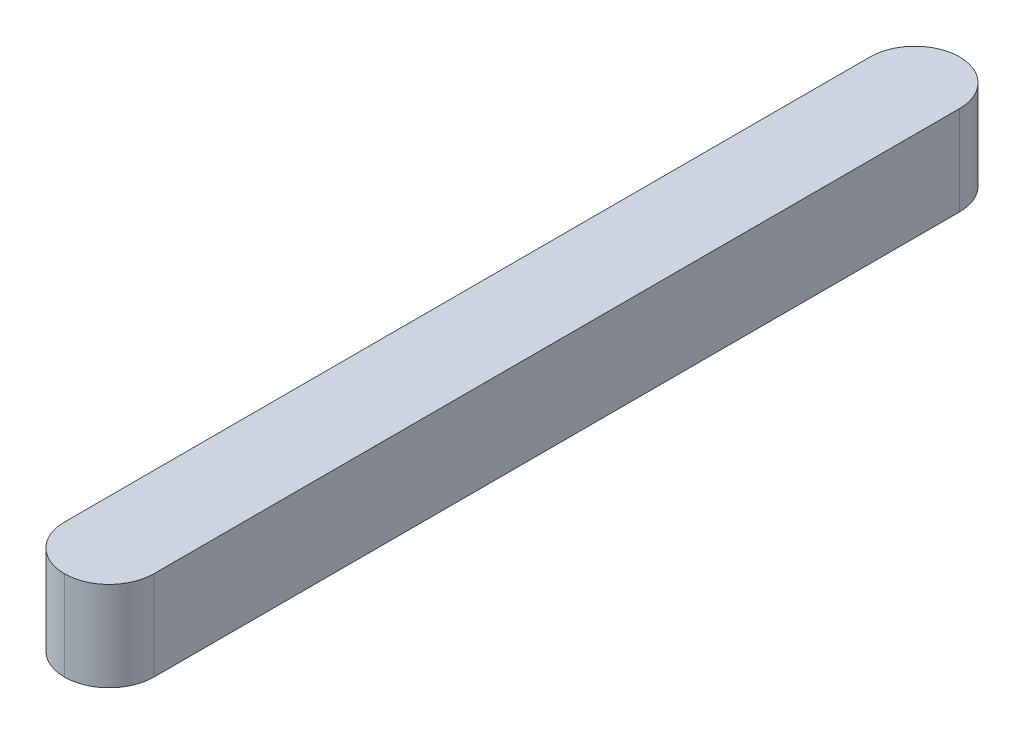
ISO-10303-21;
HEADER;
FILE_DESCRIPTION(('STEP AP214'),'2;1');
FILE_NAME('part.step','',(''),(''),'','','');
FILE_SCHEMA(('AUTOMOTIVE_DESIGN { 1 0 10303 214 1 1 1 1 }'));
ENDSEC;
DATA;
#1=APPLICATION_CONTEXT('core data for automotive mechanical design processes');
#2=APPLICATION_PROTOCOL_DEFINITION('international standard','automotive_design',2000,#1);
#3=PRODUCT_CONTEXT('',#1,'mechanical');
#4=PRODUCT('Part','Part','',(#3));
#5=PRODUCT_RELATED_PRODUCT_CATEGORY('part','',(#4));
#6=PRODUCT_DEFINITION_FORMATION('','',#4);
#7=PRODUCT_DEFINITION_CONTEXT('part definition',#1,'design');
#8=PRODUCT_DEFINITION('design','',#6,#7);
#9=PRODUCT_DEFINITION_SHAPE('','',#8);
#10=(LENGTH_UNIT() NAMED_UNIT(*) SI_UNIT(.MILLI.,.METRE.));
#11=(NAMED_UNIT(*) PLANE_ANGLE_UNIT() SI_UNIT($,.RADIAN.));
#12=(NAMED_UNIT(*) SI_UNIT($,.STERADIAN.) SOLID_ANGLE_UNIT());
#13=UNCERTAINTY_MEASURE_WITH_UNIT(LENGTH_MEASURE(1.E-05),#10,'distance_accuracy_value','');
#14=(GEOMETRIC_REPRESENTATION_CONTEXT(3) GLOBAL_UNCERTAINTY_ASSIGNED_CONTEXT((#13)) GLOBAL_UNIT_ASSIGNED_CONTEXT((#10,
#11,#12)) REPRESENTATION_CONTEXT('',''));
#15=CARTESIAN_POINT('',(0.,0.,0.));
#16=DIRECTION('',(0.,0.,1.));
#17=DIRECTION('',(1.,0.,0.));
#18=AXIS2_PLACEMENT_3D('',#15,#16,#17);
#19=CARTESIAN_POINT('',(0.,0.,60.));
#20=DIRECTION('',(1.,0.,0.));
#21=DIRECTION('',(0.,0.,-1.));
#22=AXIS2_PLACEMENT_3D('',#19,#20,#21);
#23=PLANE('',#22);
#24=DIRECTION('',(0.,0.,-1.));
#25=VECTOR('',#24,1.);
#26=CARTESIAN_POINT('',(0.,0.,60.));
#27=LINE('',#26,#25);
#28=CARTESIAN_POINT('',(0.,0.,57.));
#29=VERTEX_POINT('',#28);
#30=CARTESIAN_POINT('',(0.,0.,3.));
#31=VERTEX_POINT('',#30);
#32=EDGE_CURVE('E111',#29,#31,#27,.T.);
#33=ORIENTED_EDGE('',*,*,#32,.F.);
#34=DIRECTION('',(0.,-1.,0.));
#35=VECTOR('',#34,1.);
#36=CARTESIAN_POINT('',(0.,0.,57.));
#37=LINE('',#36,#35);
#38=CARTESIAN_POINT('',(0.,6.,57.));
#39=VERTEX_POINT('',#38);
#40=EDGE_CURVE('E11',#29,#39,#37,.F.);
#41=ORIENTED_EDGE('',*,*,#40,.T.);
#42=DIRECTION('',(0.,0.,-1.));
#43=VECTOR('',#42,1.);
#44=CARTESIAN_POINT('',(0.,6.,60.));
#45=LINE('',#44,#43);
#46=CARTESIAN_POINT('',(0.,6.,3.));
#47=VERTEX_POINT('',#46);
#48=EDGE_CURVE('E107',#39,#47,#45,.T.);
#49=ORIENTED_EDGE('',*,*,#48,.T.);
#50=DIRECTION('',(0.,-1.,0.));
#51=VECTOR('',#50,1.);
#52=CARTESIAN_POINT('',(0.,0.,3.));
#53=LINE('',#52,#51);
#54=EDGE_CURVE('E40',#47,#31,#53,.T.);
#55=ORIENTED_EDGE('',*,*,#54,.T.);
#56=EDGE_LOOP('',(#33,#41,#49,#55));
#57=FACE_BOUND('',#56,.T.);
#58=ADVANCED_FACE('F33',(#57),#23,.F.);
#59=CARTESIAN_POINT('',(0.,0.,60.));
#60=DIRECTION('',(0.,1.,0.));
#61=DIRECTION('',(0.,0.,1.));
#62=AXIS2_PLACEMENT_3D('',#59,#60,#61);
#63=PLANE('',#62);
#64=DIRECTION('',(0.,0.,-1.));
#65=VECTOR('',#64,1.);
#66=CARTESIAN_POINT('',(6.,0.,60.));
#67=LINE('',#66,#65);
#68=CARTESIAN_POINT('',(6.,0.,57.));
#69=VERTEX_POINT('',#68);
#70=CARTESIAN_POINT('',(6.,0.,3.));
#71=VERTEX_POINT('',#70);
#72=EDGE_CURVE('E106',#69,#71,#67,.T.);
#73=ORIENTED_EDGE('',*,*,#72,.F.);
#74=CARTESIAN_POINT('',(3.,0.,57.));
#75=DIRECTION('',(0.,1.,0.));
#76=DIRECTION('',(0.,0.,1.));
#77=AXIS2_PLACEMENT_3D('',#74,#75,#76);
#78=CIRCLE('',#77,3.);
#79=CARTESIAN_POINT('',(3.,0.,60.));
#80=VERTEX_POINT('',#79);
#81=EDGE_CURVE('E110',#69,#80,#78,.F.);
#82=ORIENTED_EDGE('',*,*,#81,.T.);
#83=CARTESIAN_POINT('',(3.,0.,57.));
#84=DIRECTION('',(0.,1.,0.));
#85=DIRECTION('',(0.,0.,1.));
#86=AXIS2_PLACEMENT_3D('',#83,#84,#85);
#87=CIRCLE('',#86,3.);
#88=EDGE_CURVE('E53',#80,#29,#87,.F.);
#89=ORIENTED_EDGE('',*,*,#88,.T.);
#90=ORIENTED_EDGE('',*,*,#32,.T.);
#91=CARTESIAN_POINT('',(3.,0.,3.));
#92=DIRECTION('',(0.,1.,0.));
#93=DIRECTION('',(0.,0.,1.));
#94=AXIS2_PLACEMENT_3D('',#91,#92,#93);
#95=CIRCLE('',#94,3.);
#96=CARTESIAN_POINT('',(3.,0.,0.));
#97=VERTEX_POINT('',#96);
#98=EDGE_CURVE('E95',#31,#97,#95,.F.);
#99=ORIENTED_EDGE('',*,*,#98,.T.);
#100=CARTESIAN_POINT('',(3.,0.,3.));
#101=DIRECTION('',(0.,1.,0.));
#102=DIRECTION('',(0.,0.,1.));
#103=AXIS2_PLACEMENT_3D('',#100,#101,#102);
#104=CIRCLE('',#103,3.);
#105=EDGE_CURVE('E123',#97,#71,#104,.F.);
#106=ORIENTED_EDGE('',*,*,#105,.T.);
#107=EDGE_LOOP('',(#73,#82,#89,#90,#99,#106));
#108=FACE_BOUND('',#107,.T.);
#109=ADVANCED_FACE('F126',(#108),#63,.F.);
#110=CARTESIAN_POINT('',(6.,0.,60.));
#111=DIRECTION('',(-1.,0.,0.));
#112=DIRECTION('',(0.,0.,1.));
#113=AXIS2_PLACEMENT_3D('',#110,#111,#112);
#114=PLANE('',#113);
#115=ORIENTED_EDGE('',*,*,#72,.T.);
#116=DIRECTION('',(0.,1.,0.));
#117=VECTOR('',#116,1.);
#118=CARTESIAN_POINT('',(6.,6.,3.));
#119=LINE('',#118,#117);
#120=CARTESIAN_POINT('',(6.,6.,3.));
#121=VERTEX_POINT('',#120);
#122=EDGE_CURVE('E105',#71,#121,#119,.T.);
#123=ORIENTED_EDGE('',*,*,#122,.T.);
#124=DIRECTION('',(0.,0.,-1.));
#125=VECTOR('',#124,1.);
#126=CARTESIAN_POINT('',(6.,6.,60.));
#127=LINE('',#126,#125);
#128=CARTESIAN_POINT('',(6.,6.,57.));
#129=VERTEX_POINT('',#128);
#130=EDGE_CURVE('E87',#129,#121,#127,.T.);
#131=ORIENTED_EDGE('',*,*,#130,.F.);
#132=DIRECTION('',(0.,1.,0.));
#133=VECTOR('',#132,1.);
#134=CARTESIAN_POINT('',(6.,0.,57.));
#135=LINE('',#134,#133);
#136=EDGE_CURVE('E102',#129,#69,#135,.F.);
#137=ORIENTED_EDGE('',*,*,#136,.T.);
#138=EDGE_LOOP('',(#115,#123,#131,#137));
#139=FACE_BOUND('',#138,.T.);
#140=ADVANCED_FACE('F101',(#139),#114,.F.);
#141=CARTESIAN_POINT('',(0.,6.,60.));
#142=DIRECTION('',(0.,-1.,0.));
#143=DIRECTION('',(0.,0.,-1.));
#144=AXIS2_PLACEMENT_3D('',#141,#142,#143);
#145=PLANE('',#144);
#146=CARTESIAN_POINT('',(3.,6.,57.));
#147=DIRECTION('',(0.,-1.,0.));
#148=DIRECTION('',(0.,0.,-1.));
#149=AXIS2_PLACEMENT_3D('',#146,#147,#148);
#150=CIRCLE('',#149,3.);
#151=CARTESIAN_POINT('',(3.,6.,60.));
#152=VERTEX_POINT('',#151);
#153=EDGE_CURVE('E90',#39,#152,#150,.F.);
#154=ORIENTED_EDGE('',*,*,#153,.T.);
#155=CARTESIAN_POINT('',(3.,6.,57.));
#156=DIRECTION('',(0.,-1.,0.));
#157=DIRECTION('',(0.,0.,-1.));
#158=AXIS2_PLACEMENT_3D('',#155,#156,#157);
#159=CIRCLE('',#158,3.);
#160=EDGE_CURVE('E84',#152,#129,#159,.F.);
#161=ORIENTED_EDGE('',*,*,#160,.T.);
#162=ORIENTED_EDGE('',*,*,#130,.T.);
#163=CARTESIAN_POINT('',(3.,6.,3.));
#164=DIRECTION('',(0.,-1.,0.));
#165=DIRECTION('',(0.,0.,-1.));
#166=AXIS2_PLACEMENT_3D('',#163,#164,#165);
#167=CIRCLE('',#166,3.);
#168=CARTESIAN_POINT('',(3.,6.,0.));
#169=VERTEX_POINT('',#168);
#170=EDGE_CURVE('E119',#121,#169,#167,.F.);
#171=ORIENTED_EDGE('',*,*,#170,.T.);
#172=CARTESIAN_POINT('',(3.,6.,3.));
#173=DIRECTION('',(0.,-1.,0.));
#174=DIRECTION('',(0.,0.,-1.));
#175=AXIS2_PLACEMENT_3D('',#172,#173,#174);
#176=CIRCLE('',#175,3.);
#177=EDGE_CURVE('E113',#169,#47,#176,.F.);
#178=ORIENTED_EDGE('',*,*,#177,.T.);
#179=ORIENTED_EDGE('',*,*,#48,.F.);
#180=EDGE_LOOP('',(#154,#161,#162,#171,#178,#179));
#181=FACE_BOUND('',#180,.T.);
#182=ADVANCED_FACE('F86',(#181),#145,.F.);
#183=CARTESIAN_POINT('',(3.,0.,3.));
#184=DIRECTION('',(0.,1.,0.));
#185=DIRECTION('',(0.,0.,1.));
#186=AXIS2_PLACEMENT_3D('',#183,#184,#185);
#187=CYLINDRICAL_SURFACE('',#186,3.);
#188=DIRECTION('',(0.,-1.,0.));
#189=VECTOR('',#188,1.);
#190=CARTESIAN_POINT('',(3.,6.,0.));
#191=LINE('',#190,#189);
#192=EDGE_CURVE('E131',#97,#169,#191,.F.);
#193=ORIENTED_EDGE('',*,*,#192,.F.);
#194=ORIENTED_EDGE('',*,*,#98,.F.);
#195=ORIENTED_EDGE('',*,*,#54,.F.);
#196=ORIENTED_EDGE('',*,*,#177,.F.);
#197=EDGE_LOOP('',(#193,#194,#195,#196));
#198=FACE_BOUND('',#197,.T.);
#199=ADVANCED_FACE('F142',(#198),#187,.T.);
#200=CARTESIAN_POINT('',(3.,0.,3.));
#201=DIRECTION('',(0.,-1.,0.));
#202=DIRECTION('',(0.,0.,-1.));
#203=AXIS2_PLACEMENT_3D('',#200,#201,#202);
#204=CYLINDRICAL_SURFACE('',#203,3.);
#205=ORIENTED_EDGE('',*,*,#105,.F.);
#206=ORIENTED_EDGE('',*,*,#192,.T.);
#207=ORIENTED_EDGE('',*,*,#170,.F.);
#208=ORIENTED_EDGE('',*,*,#122,.F.);
#209=EDGE_LOOP('',(#205,#206,#207,#208));
#210=FACE_BOUND('',#209,.T.);
#211=ADVANCED_FACE('F138',(#210),#204,.T.);
#212=CARTESIAN_POINT('',(3.,6.,57.));
#213=DIRECTION('',(0.,-1.,0.));
#214=DIRECTION('',(0.,0.,-1.));
#215=AXIS2_PLACEMENT_3D('',#212,#213,#214);
#216=CYLINDRICAL_SURFACE('',#215,3.);
#217=ORIENTED_EDGE('',*,*,#40,.F.);
#218=ORIENTED_EDGE('',*,*,#88,.F.);
#219=DIRECTION('',(0.,-1.,0.));
#220=VECTOR('',#219,1.);
#221=CARTESIAN_POINT('',(3.,6.,60.));
#222=LINE('',#221,#220);
#223=EDGE_CURVE('E130',#152,#80,#222,.T.);
#224=ORIENTED_EDGE('',*,*,#223,.F.);
#225=ORIENTED_EDGE('',*,*,#153,.F.);
#226=EDGE_LOOP('',(#217,#218,#224,#225));
#227=FACE_BOUND('',#226,.T.);
#228=ADVANCED_FACE('F129',(#227),#216,.T.);
#229=CARTESIAN_POINT('',(3.,6.,57.));
#230=DIRECTION('',(0.,1.,0.));
#231=DIRECTION('',(0.,0.,1.));
#232=AXIS2_PLACEMENT_3D('',#229,#230,#231);
#233=CYLINDRICAL_SURFACE('',#232,3.);
#234=ORIENTED_EDGE('',*,*,#81,.F.);
#235=ORIENTED_EDGE('',*,*,#136,.F.);
#236=ORIENTED_EDGE('',*,*,#160,.F.);
#237=ORIENTED_EDGE('',*,*,#223,.T.);
#238=EDGE_LOOP('',(#234,#235,#236,#237));
#239=FACE_BOUND('',#238,.T.);
#240=ADVANCED_FACE('F109',(#239),#233,.T.);
#241=CLOSED_SHELL('',(#58,#109,#140,#182,#199,#211,#228,#240));
#242=MANIFOLD_SOLID_BREP('B2',#241);
#243=ADVANCED_BREP_SHAPE_REPRESENTATION('',(#18,#242),#14);
#244=SHAPE_DEFINITION_REPRESENTATION(#9,#243);
ENDSEC;
END-ISO-10303-21;
